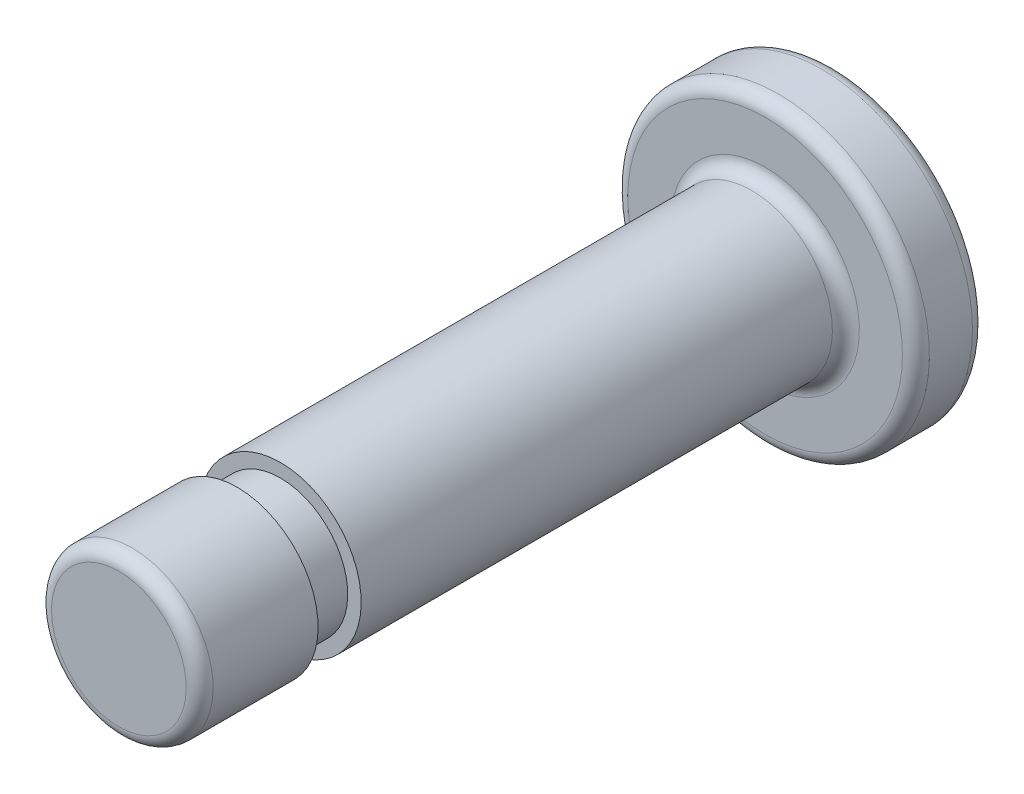
ISO-10303-21;
HEADER;
FILE_DESCRIPTION(('STEP AP214'),'2;1');
FILE_NAME('part.step','',(''),(''),'','','');
FILE_SCHEMA(('AUTOMOTIVE_DESIGN { 1 0 10303 214 1 1 1 1 }'));
ENDSEC;
DATA;
#1=APPLICATION_CONTEXT('core data for automotive mechanical design processes');
#2=APPLICATION_PROTOCOL_DEFINITION('international standard','automotive_design',2000,#1);
#3=PRODUCT_CONTEXT('',#1,'mechanical');
#4=PRODUCT('Part','Part','',(#3));
#5=PRODUCT_RELATED_PRODUCT_CATEGORY('part','',(#4));
#6=PRODUCT_DEFINITION_FORMATION('','',#4);
#7=PRODUCT_DEFINITION_CONTEXT('part definition',#1,'design');
#8=PRODUCT_DEFINITION('design','',#6,#7);
#9=PRODUCT_DEFINITION_SHAPE('','',#8);
#10=(LENGTH_UNIT() NAMED_UNIT(*) SI_UNIT(.MILLI.,.METRE.));
#11=(NAMED_UNIT(*) PLANE_ANGLE_UNIT() SI_UNIT($,.RADIAN.));
#12=(NAMED_UNIT(*) SI_UNIT($,.STERADIAN.) SOLID_ANGLE_UNIT());
#13=UNCERTAINTY_MEASURE_WITH_UNIT(LENGTH_MEASURE(1.E-05),#10,'distance_accuracy_value','');
#14=(GEOMETRIC_REPRESENTATION_CONTEXT(3) GLOBAL_UNCERTAINTY_ASSIGNED_CONTEXT((#13)) GLOBAL_UNIT_ASSIGNED_CONTEXT((#10,
#11,#12)) REPRESENTATION_CONTEXT('',''));
#15=CARTESIAN_POINT('',(0.,0.,0.));
#16=DIRECTION('',(0.,0.,1.));
#17=DIRECTION('',(1.,0.,0.));
#18=AXIS2_PLACEMENT_3D('',#15,#16,#17);
#19=CARTESIAN_POINT('',(0.,0.,0.));
#20=DIRECTION('',(0.,0.,-1.));
#21=DIRECTION('',(0.,1.,0.));
#22=AXIS2_PLACEMENT_3D('',#19,#20,#21);
#23=PLANE('',#22);
#24=CARTESIAN_POINT('',(0.,0.,0.));
#25=DIRECTION('',(0.,0.,-1.));
#26=DIRECTION('',(0.,1.,0.));
#27=AXIS2_PLACEMENT_3D('',#24,#25,#26);
#28=CIRCLE('',#27,1.25);
#29=CARTESIAN_POINT('',(0.,1.25,0.));
#30=VERTEX_POINT('',#29);
#31=EDGE_CURVE('E65',#30,#30,#28,.F.);
#32=ORIENTED_EDGE('',*,*,#31,.T.);
#33=EDGE_LOOP('',(#32));
#34=FACE_BOUND('',#33,.T.);
#35=ADVANCED_FACE('F39',(#34),#23,.F.);
#36=CARTESIAN_POINT('',(0.,0.,-13.3));
#37=DIRECTION('',(0.,0.,-1.));
#38=DIRECTION('',(0.,1.,0.));
#39=AXIS2_PLACEMENT_3D('',#36,#37,#38);
#40=CYLINDRICAL_SURFACE('',#39,1.5);
#41=CARTESIAN_POINT('',(0.,0.,-0.25));
#42=DIRECTION('',(0.,0.,-1.));
#43=DIRECTION('',(0.,1.,0.));
#44=AXIS2_PLACEMENT_3D('',#41,#42,#43);
#45=CIRCLE('',#44,1.5);
#46=CARTESIAN_POINT('',(0.,1.5,-0.25));
#47=VERTEX_POINT('',#46);
#48=EDGE_CURVE('E68',#47,#47,#45,.T.);
#49=ORIENTED_EDGE('',*,*,#48,.T.);
#50=EDGE_LOOP('',(#49));
#51=FACE_BOUND('',#50,.T.);
#52=CARTESIAN_POINT('',(0.,0.,-2.2));
#53=DIRECTION('',(0.,0.,-1.));
#54=DIRECTION('',(0.,1.,0.));
#55=AXIS2_PLACEMENT_3D('',#52,#53,#54);
#56=CIRCLE('',#55,1.5);
#57=CARTESIAN_POINT('',(0.,1.5,-2.2));
#58=VERTEX_POINT('',#57);
#59=EDGE_CURVE('E71',#58,#58,#56,.T.);
#60=ORIENTED_EDGE('',*,*,#59,.F.);
#61=EDGE_LOOP('',(#60));
#62=FACE_BOUND('',#61,.T.);
#63=ADVANCED_FACE('F101',(#51,#62),#40,.T.);
#64=CARTESIAN_POINT('',(0.,-1.5,-2.2));
#65=DIRECTION('',(0.,0.,1.));
#66=DIRECTION('',(0.,-1.,0.));
#67=AXIS2_PLACEMENT_3D('',#64,#65,#66);
#68=PLANE('',#67);
#69=CARTESIAN_POINT('',(0.,0.,-2.2));
#70=DIRECTION('',(0.,0.,-1.));
#71=DIRECTION('',(0.,1.,0.));
#72=AXIS2_PLACEMENT_3D('',#69,#70,#71);
#73=CIRCLE('',#72,1.25);
#74=CARTESIAN_POINT('',(0.,1.25,-2.2));
#75=VERTEX_POINT('',#74);
#76=EDGE_CURVE('E74',#75,#75,#73,.T.);
#77=ORIENTED_EDGE('',*,*,#76,.F.);
#78=EDGE_LOOP('',(#77));
#79=FACE_BOUND('',#78,.T.);
#80=ORIENTED_EDGE('',*,*,#59,.T.);
#81=EDGE_LOOP('',(#80));
#82=FACE_BOUND('',#81,.T.);
#83=ADVANCED_FACE('F95',(#79,#82),#68,.F.);
#84=CARTESIAN_POINT('',(0.,0.,-13.3));
#85=DIRECTION('',(0.,0.,-1.));
#86=DIRECTION('',(0.,1.,0.));
#87=AXIS2_PLACEMENT_3D('',#84,#85,#86);
#88=CYLINDRICAL_SURFACE('',#87,1.25);
#89=CARTESIAN_POINT('',(0.,0.,-3.));
#90=DIRECTION('',(0.,0.,-1.));
#91=DIRECTION('',(0.,1.,0.));
#92=AXIS2_PLACEMENT_3D('',#89,#90,#91);
#93=CIRCLE('',#92,1.25);
#94=CARTESIAN_POINT('',(0.,1.25,-3.));
#95=VERTEX_POINT('',#94);
#96=EDGE_CURVE('E77',#95,#95,#93,.T.);
#97=ORIENTED_EDGE('',*,*,#96,.F.);
#98=EDGE_LOOP('',(#97));
#99=FACE_BOUND('',#98,.T.);
#100=ORIENTED_EDGE('',*,*,#76,.T.);
#101=EDGE_LOOP('',(#100));
#102=FACE_BOUND('',#101,.T.);
#103=ADVANCED_FACE('F89',(#99,#102),#88,.T.);
#104=CARTESIAN_POINT('',(0.,-1.25,-3.));
#105=DIRECTION('',(0.,0.,-1.));
#106=DIRECTION('',(0.,1.,0.));
#107=AXIS2_PLACEMENT_3D('',#104,#105,#106);
#108=PLANE('',#107);
#109=CARTESIAN_POINT('',(0.,0.,-3.));
#110=DIRECTION('',(0.,0.,-1.));
#111=DIRECTION('',(0.,1.,0.));
#112=AXIS2_PLACEMENT_3D('',#109,#110,#111);
#113=CIRCLE('',#112,1.5);
#114=CARTESIAN_POINT('',(0.,1.5,-3.));
#115=VERTEX_POINT('',#114);
#116=EDGE_CURVE('E80',#115,#115,#113,.T.);
#117=ORIENTED_EDGE('',*,*,#116,.F.);
#118=EDGE_LOOP('',(#117));
#119=FACE_BOUND('',#118,.T.);
#120=ORIENTED_EDGE('',*,*,#96,.T.);
#121=EDGE_LOOP('',(#120));
#122=FACE_BOUND('',#121,.T.);
#123=ADVANCED_FACE('F86',(#119,#122),#108,.F.);
#124=CARTESIAN_POINT('',(0.,0.,-13.3));
#125=DIRECTION('',(0.,0.,-1.));
#126=DIRECTION('',(0.,1.,0.));
#127=AXIS2_PLACEMENT_3D('',#124,#125,#126);
#128=CYLINDRICAL_SURFACE('',#127,1.5);
#129=CARTESIAN_POINT('',(0.,0.,-11.75));
#130=DIRECTION('',(0.,0.,-1.));
#131=DIRECTION('',(0.,1.,0.));
#132=AXIS2_PLACEMENT_3D('',#129,#130,#131);
#133=CIRCLE('',#132,1.5);
#134=CARTESIAN_POINT('',(0.,1.5,-11.75));
#135=VERTEX_POINT('',#134);
#136=EDGE_CURVE('E10',#135,#135,#133,.F.);
#137=ORIENTED_EDGE('',*,*,#136,.T.);
#138=EDGE_LOOP('',(#137));
#139=FACE_BOUND('',#138,.T.);
#140=ORIENTED_EDGE('',*,*,#116,.T.);
#141=EDGE_LOOP('',(#140));
#142=FACE_BOUND('',#141,.T.);
#143=ADVANCED_FACE('F84',(#139,#142),#128,.T.);
#144=CARTESIAN_POINT('',(0.,-1.5,-12.));
#145=DIRECTION('',(0.,0.,-1.));
#146=DIRECTION('',(0.,1.,0.));
#147=AXIS2_PLACEMENT_3D('',#144,#145,#146);
#148=PLANE('',#147);
#149=CARTESIAN_POINT('',(0.,0.,-12.));
#150=DIRECTION('',(0.,0.,-1.));
#151=DIRECTION('',(0.,1.,0.));
#152=AXIS2_PLACEMENT_3D('',#149,#150,#151);
#153=CIRCLE('',#152,2.55);
#154=CARTESIAN_POINT('',(0.,2.55,-12.));
#155=VERTEX_POINT('',#154);
#156=EDGE_CURVE('E46',#155,#155,#153,.F.);
#157=ORIENTED_EDGE('',*,*,#156,.T.);
#158=EDGE_LOOP('',(#157));
#159=FACE_BOUND('',#158,.T.);
#160=CARTESIAN_POINT('',(0.,0.,-12.));
#161=DIRECTION('',(0.,0.,-1.));
#162=DIRECTION('',(0.,1.,0.));
#163=AXIS2_PLACEMENT_3D('',#160,#161,#162);
#164=CIRCLE('',#163,1.75);
#165=CARTESIAN_POINT('',(0.,1.75,-12.));
#166=VERTEX_POINT('',#165);
#167=EDGE_CURVE('E50',#166,#166,#164,.T.);
#168=ORIENTED_EDGE('',*,*,#167,.T.);
#169=EDGE_LOOP('',(#168));
#170=FACE_BOUND('',#169,.T.);
#171=ADVANCED_FACE('F135',(#159,#170),#148,.F.);
#172=CARTESIAN_POINT('',(0.,0.,-13.3));
#173=DIRECTION('',(0.,0.,-1.));
#174=DIRECTION('',(0.,1.,0.));
#175=AXIS2_PLACEMENT_3D('',#172,#173,#174);
#176=CYLINDRICAL_SURFACE('',#175,2.8);
#177=CARTESIAN_POINT('',(0.,0.,-13.05));
#178=DIRECTION('',(0.,0.,1.));
#179=DIRECTION('',(0.,-1.,0.));
#180=AXIS2_PLACEMENT_3D('',#177,#178,#179);
#181=CIRCLE('',#180,2.8);
#182=CARTESIAN_POINT('',(0.,-2.8,-13.05));
#183=VERTEX_POINT('',#182);
#184=EDGE_CURVE('E54',#183,#183,#181,.T.);
#185=ORIENTED_EDGE('',*,*,#184,.T.);
#186=EDGE_LOOP('',(#185));
#187=FACE_BOUND('',#186,.T.);
#188=CARTESIAN_POINT('',(0.,0.,-12.25));
#189=DIRECTION('',(0.,0.,-1.));
#190=DIRECTION('',(0.,1.,0.));
#191=AXIS2_PLACEMENT_3D('',#188,#189,#190);
#192=CIRCLE('',#191,2.8);
#193=CARTESIAN_POINT('',(0.,2.8,-12.25));
#194=VERTEX_POINT('',#193);
#195=EDGE_CURVE('E59',#194,#194,#192,.T.);
#196=ORIENTED_EDGE('',*,*,#195,.T.);
#197=EDGE_LOOP('',(#196));
#198=FACE_BOUND('',#197,.T.);
#199=ADVANCED_FACE('F133',(#187,#198),#176,.T.);
#200=CARTESIAN_POINT('',(0.,-2.8,-13.3));
#201=DIRECTION('',(0.,0.,1.));
#202=DIRECTION('',(0.,-1.,0.));
#203=AXIS2_PLACEMENT_3D('',#200,#201,#202);
#204=PLANE('',#203);
#205=CARTESIAN_POINT('',(0.,0.,-13.3));
#206=DIRECTION('',(0.,0.,1.));
#207=DIRECTION('',(0.,-1.,0.));
#208=AXIS2_PLACEMENT_3D('',#205,#206,#207);
#209=CIRCLE('',#208,2.55);
#210=CARTESIAN_POINT('',(0.,-2.55,-13.3));
#211=VERTEX_POINT('',#210);
#212=EDGE_CURVE('E62',#211,#211,#209,.F.);
#213=ORIENTED_EDGE('',*,*,#212,.T.);
#214=EDGE_LOOP('',(#213));
#215=FACE_BOUND('',#214,.T.);
#216=ADVANCED_FACE('F119',(#215),#204,.F.);
#217=CARTESIAN_POINT('',(0.,0.,-0.25));
#218=DIRECTION('',(0.,0.,-1.));
#219=DIRECTION('',(0.,1.,0.));
#220=AXIS2_PLACEMENT_3D('',#217,#218,#219);
#221=TOROIDAL_SURFACE('',#220,1.25,0.25);
#222=ORIENTED_EDGE('',*,*,#31,.F.);
#223=EDGE_LOOP('',(#222));
#224=FACE_BOUND('',#223,.T.);
#225=ORIENTED_EDGE('',*,*,#48,.F.);
#226=EDGE_LOOP('',(#225));
#227=FACE_BOUND('',#226,.T.);
#228=ADVANCED_FACE('F115',(#224,#227),#221,.T.);
#229=CARTESIAN_POINT('',(0.,0.,-13.05));
#230=DIRECTION('',(0.,0.,1.));
#231=DIRECTION('',(0.,-1.,0.));
#232=AXIS2_PLACEMENT_3D('',#229,#230,#231);
#233=TOROIDAL_SURFACE('',#232,2.55,0.25);
#234=ORIENTED_EDGE('',*,*,#184,.F.);
#235=EDGE_LOOP('',(#234));
#236=FACE_BOUND('',#235,.T.);
#237=ORIENTED_EDGE('',*,*,#212,.F.);
#238=EDGE_LOOP('',(#237));
#239=FACE_BOUND('',#238,.T.);
#240=ADVANCED_FACE('F118',(#236,#239),#233,.T.);
#241=CARTESIAN_POINT('',(0.,0.,-12.25));
#242=DIRECTION('',(0.,0.,-1.));
#243=DIRECTION('',(0.,1.,0.));
#244=AXIS2_PLACEMENT_3D('',#241,#242,#243);
#245=TOROIDAL_SURFACE('',#244,2.55,0.25);
#246=ORIENTED_EDGE('',*,*,#156,.F.);
#247=EDGE_LOOP('',(#246));
#248=FACE_BOUND('',#247,.T.);
#249=ORIENTED_EDGE('',*,*,#195,.F.);
#250=EDGE_LOOP('',(#249));
#251=FACE_BOUND('',#250,.T.);
#252=ADVANCED_FACE('F122',(#248,#251),#245,.T.);
#253=CARTESIAN_POINT('',(0.,0.,-11.75));
#254=DIRECTION('',(0.,0.,-1.));
#255=DIRECTION('',(0.,1.,0.));
#256=AXIS2_PLACEMENT_3D('',#253,#254,#255);
#257=TOROIDAL_SURFACE('',#256,1.75,0.25);
#258=ORIENTED_EDGE('',*,*,#136,.F.);
#259=EDGE_LOOP('',(#258));
#260=FACE_BOUND('',#259,.T.);
#261=ORIENTED_EDGE('',*,*,#167,.F.);
#262=EDGE_LOOP('',(#261));
#263=FACE_BOUND('',#262,.T.);
#264=ADVANCED_FACE('F41',(#260,#263),#257,.F.);
#265=CLOSED_SHELL('',(#35,#63,#83,#103,#123,#143,#171,#199,#216,#228,#240,#252,#264));
#266=MANIFOLD_SOLID_BREP('B2',#265);
#267=ADVANCED_BREP_SHAPE_REPRESENTATION('',(#18,#266),#14);
#268=SHAPE_DEFINITION_REPRESENTATION(#9,#267);
ENDSEC;
END-ISO-10303-21;
